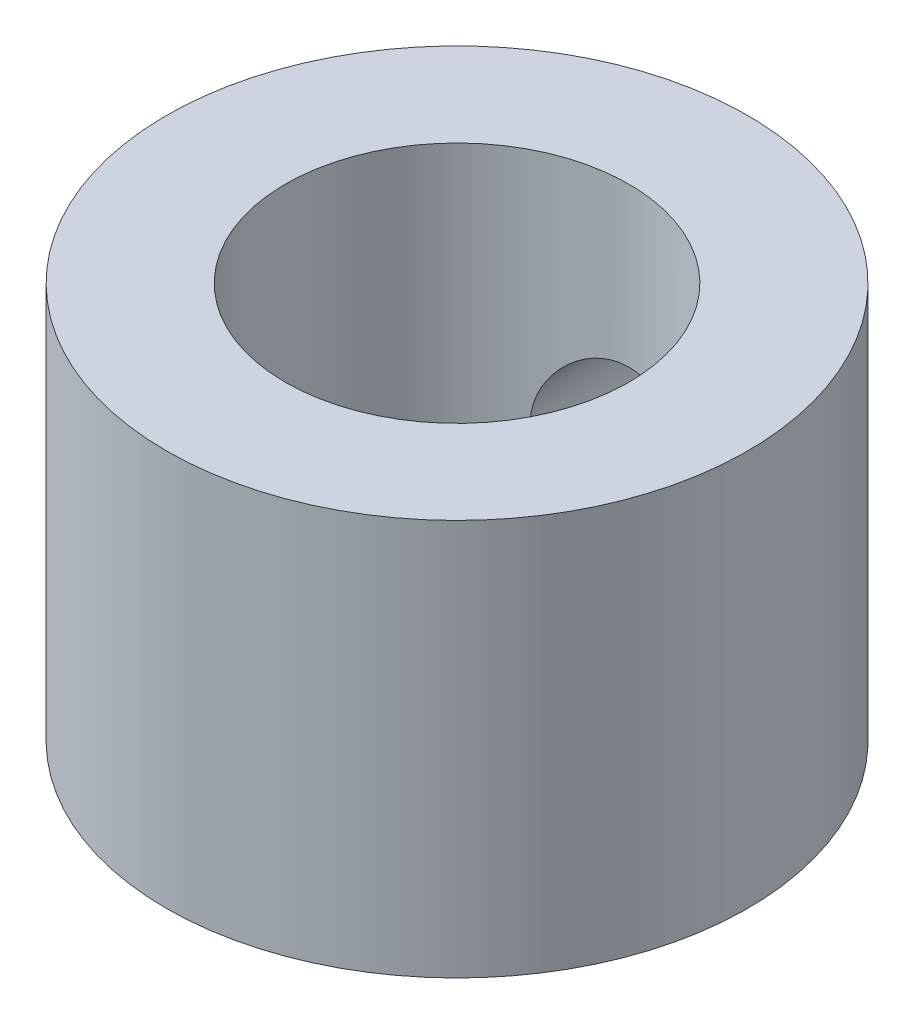
ISO-10303-21;
HEADER;
FILE_DESCRIPTION(('STEP AP214'),'2;1');
FILE_NAME('part.step','',(''),(''),'','','');
FILE_SCHEMA(('AUTOMOTIVE_DESIGN { 1 0 10303 214 1 1 1 1 }'));
ENDSEC;
DATA;
#1=APPLICATION_CONTEXT('core data for automotive mechanical design processes');
#2=APPLICATION_PROTOCOL_DEFINITION('international standard','automotive_design',2000,#1);
#3=PRODUCT_CONTEXT('',#1,'mechanical');
#4=PRODUCT('Part','Part','',(#3));
#5=PRODUCT_RELATED_PRODUCT_CATEGORY('part','',(#4));
#6=PRODUCT_DEFINITION_FORMATION('','',#4);
#7=PRODUCT_DEFINITION_CONTEXT('part definition',#1,'design');
#8=PRODUCT_DEFINITION('design','',#6,#7);
#9=PRODUCT_DEFINITION_SHAPE('','',#8);
#10=(LENGTH_UNIT() NAMED_UNIT(*) SI_UNIT(.MILLI.,.METRE.));
#11=(NAMED_UNIT(*) PLANE_ANGLE_UNIT() SI_UNIT($,.RADIAN.));
#12=(NAMED_UNIT(*) SI_UNIT($,.STERADIAN.) SOLID_ANGLE_UNIT());
#13=UNCERTAINTY_MEASURE_WITH_UNIT(LENGTH_MEASURE(1.E-05),#10,'distance_accuracy_value','');
#14=(GEOMETRIC_REPRESENTATION_CONTEXT(3) GLOBAL_UNCERTAINTY_ASSIGNED_CONTEXT((#13)) GLOBAL_UNIT_ASSIGNED_CONTEXT((#10,
#11,#12)) REPRESENTATION_CONTEXT('',''));
#15=CARTESIAN_POINT('',(0.,0.,0.));
#16=DIRECTION('',(0.,0.,1.));
#17=DIRECTION('',(1.,0.,0.));
#18=AXIS2_PLACEMENT_3D('',#15,#16,#17);
#19=CARTESIAN_POINT('',(0.,15.,0.));
#20=DIRECTION('',(0.,1.,0.));
#21=DIRECTION('',(0.,0.,1.));
#22=AXIS2_PLACEMENT_3D('',#19,#20,#21);
#23=PLANE('',#22);
#24=CARTESIAN_POINT('',(0.,15.,0.));
#25=DIRECTION('',(0.,1.,0.));
#26=DIRECTION('',(0.,0.,1.));
#27=AXIS2_PLACEMENT_3D('',#24,#25,#26);
#28=CIRCLE('',#27,11.);
#29=CARTESIAN_POINT('',(0.,15.,11.));
#30=VERTEX_POINT('',#29);
#31=EDGE_CURVE('E12',#30,#30,#28,.T.);
#32=ORIENTED_EDGE('',*,*,#31,.T.);
#33=EDGE_LOOP('',(#32));
#34=FACE_BOUND('',#33,.T.);
#35=CARTESIAN_POINT('',(0.,15.,0.));
#36=DIRECTION('',(0.,1.,0.));
#37=DIRECTION('',(0.,0.,1.));
#38=AXIS2_PLACEMENT_3D('',#35,#36,#37);
#39=CIRCLE('',#38,6.5);
#40=CARTESIAN_POINT('',(0.,15.,6.5));
#41=VERTEX_POINT('',#40);
#42=EDGE_CURVE('E64',#41,#41,#39,.T.);
#43=ORIENTED_EDGE('',*,*,#42,.F.);
#44=EDGE_LOOP('',(#43));
#45=FACE_BOUND('',#44,.T.);
#46=ADVANCED_FACE('F46',(#34,#45),#23,.T.);
#47=CARTESIAN_POINT('',(0.,0.,0.));
#48=DIRECTION('',(0.,1.,0.));
#49=DIRECTION('',(0.,0.,1.));
#50=AXIS2_PLACEMENT_3D('',#47,#48,#49);
#51=PLANE('',#50);
#52=CARTESIAN_POINT('',(0.,0.,0.));
#53=DIRECTION('',(0.,1.,0.));
#54=DIRECTION('',(0.,0.,1.));
#55=AXIS2_PLACEMENT_3D('',#52,#53,#54);
#56=CIRCLE('',#55,11.);
#57=CARTESIAN_POINT('',(0.,0.,11.));
#58=VERTEX_POINT('',#57);
#59=EDGE_CURVE('E59',#58,#58,#56,.T.);
#60=ORIENTED_EDGE('',*,*,#59,.F.);
#61=EDGE_LOOP('',(#60));
#62=FACE_BOUND('',#61,.T.);
#63=CARTESIAN_POINT('',(0.,0.,0.));
#64=DIRECTION('',(0.,1.,0.));
#65=DIRECTION('',(0.,0.,1.));
#66=AXIS2_PLACEMENT_3D('',#63,#64,#65);
#67=CIRCLE('',#66,6.5);
#68=CARTESIAN_POINT('',(0.,0.,6.5));
#69=VERTEX_POINT('',#68);
#70=EDGE_CURVE('E66',#69,#69,#67,.T.);
#71=ORIENTED_EDGE('',*,*,#70,.T.);
#72=EDGE_LOOP('',(#71));
#73=FACE_BOUND('',#72,.T.);
#74=ADVANCED_FACE('F86',(#62,#73),#51,.F.);
#75=CARTESIAN_POINT('',(0.,15.,0.));
#76=DIRECTION('',(0.,-1.,0.));
#77=DIRECTION('',(0.,0.,-1.));
#78=AXIS2_PLACEMENT_3D('',#75,#76,#77);
#79=CYLINDRICAL_SURFACE('',#78,11.);
#80=CARTESIAN_POINT('',(0.,9.00000000000001,-11.));
#81=CARTESIAN_POINT('',(-0.165241826664359,8.99999637477795,-10.9999976543482));
#82=CARTESIAN_POINT('',(-0.330521957625387,8.98630187283317,-10.9962401452152));
#83=CARTESIAN_POINT('',(-0.656311860315367,8.93198833939365,-10.981615961709));
#84=CARTESIAN_POINT('',(-0.816819455954503,8.89135721674283,-10.97074609481));
#85=CARTESIAN_POINT('',(-1.12831525211077,8.78459653652316,-10.9430954434827));
#86=CARTESIAN_POINT('',(-1.27931573394031,8.71850069467618,-10.9263224773879));
#87=CARTESIAN_POINT('',(-1.56808899231943,8.56281413467515,-10.888633088257));
#88=CARTESIAN_POINT('',(-1.70586072657954,8.47322156729214,-10.8677163391303));
#89=CARTESIAN_POINT('',(-1.96759389514652,8.27080032706547,-10.8234279408412));
#90=CARTESIAN_POINT('',(-2.09119025833987,8.15750911829158,-10.8000128298086));
#91=CARTESIAN_POINT('',(-2.31788587364956,7.91189472794017,-10.7536422587013));
#92=CARTESIAN_POINT('',(-2.42098235649443,7.77956897919535,-10.730686861104));
#93=CARTESIAN_POINT('',(-2.60555589078994,7.49669750484103,-10.6873876832732));
#94=CARTESIAN_POINT('',(-2.68660853675171,7.34586571012742,-10.6670986011725));
#95=CARTESIAN_POINT('',(-2.82205832722454,7.03207234360122,-10.6320701482383));
#96=CARTESIAN_POINT('',(-2.87646063893689,6.869113130223,-10.6173297017151));
#97=CARTESIAN_POINT('',(-2.95578912882535,6.53974420997505,-10.5955169438548));
#98=CARTESIAN_POINT('',(-2.98137921086456,6.37350610367614,-10.5882722456757));
#99=CARTESIAN_POINT('',(-3.00442728818264,6.03895063398236,-10.5817565816817));
#100=CARTESIAN_POINT('',(-3.00189080281764,5.87063368499994,-10.5824840514652));
#101=CARTESIAN_POINT('',(-2.96928383560601,5.54191689806745,-10.5916764975091));
#102=CARTESIAN_POINT('',(-2.94002147337861,5.38142953079554,-10.5999143662734));
#103=CARTESIAN_POINT('',(-2.85608967743611,5.0677334279544,-10.6228351158812));
#104=CARTESIAN_POINT('',(-2.80141813009295,4.91452529906742,-10.6375185328831));
#105=CARTESIAN_POINT('',(-2.66757259652941,4.61765295890511,-10.6718723658465));
#106=CARTESIAN_POINT('',(-2.58811903765894,4.47412159793279,-10.6915991952828));
#107=CARTESIAN_POINT('',(-2.40715976044346,4.20214710518069,-10.7337873759558));
#108=CARTESIAN_POINT('',(-2.30564952212417,4.07370707432251,-10.756249287265));
#109=CARTESIAN_POINT('',(-2.07934693365792,3.83094962038712,-10.8023178998121));
#110=CARTESIAN_POINT('',(-1.95387729233449,3.71726510142213,-10.8259374859423));
#111=CARTESIAN_POINT('',(-1.68536402357725,3.51241807004444,-10.8709729541596));
#112=CARTESIAN_POINT('',(-1.54231963943708,3.42125652790077,-10.8923887412858));
#113=CARTESIAN_POINT('',(-1.24170790747923,3.26374665445016,-10.9307455624252));
#114=CARTESIAN_POINT('',(-1.08407527483553,3.19751732283211,-10.9476650257461));
#115=CARTESIAN_POINT('',(-0.759345377428762,3.09268405497172,-10.9749671228522));
#116=CARTESIAN_POINT('',(-0.592250288635342,3.05407379511175,-10.9853512528913));
#117=CARTESIAN_POINT('',(-0.258736340966483,3.00657876440608,-10.9981845755262));
#118=CARTESIAN_POINT('',(-0.092448595567949,2.99683400935928,-11.0008632625074));
#119=CARTESIAN_POINT('',(0.239386731275946,3.00496549502686,-10.9986460317028));
#120=CARTESIAN_POINT('',(0.404934391065013,3.02283873923299,-10.9937509356601));
#121=CARTESIAN_POINT('',(0.7274901954791,3.08499500540627,-10.977084785319));
#122=CARTESIAN_POINT('',(0.884598648545333,3.12879438551397,-10.965439729442));
#123=CARTESIAN_POINT('',(1.18921973489727,3.24099448928101,-10.9365984707135));
#124=CARTESIAN_POINT('',(1.33673130261003,3.30939793932271,-10.9194016526918));
#125=CARTESIAN_POINT('',(1.62128232238913,3.47043288457121,-10.8808314765631));
#126=CARTESIAN_POINT('',(1.75804920482498,3.56352697452253,-10.8593805909887));
#127=CARTESIAN_POINT('',(2.01432044026184,3.77072257509104,-10.8147797682096));
#128=CARTESIAN_POINT('',(2.13382121235599,3.88482843231711,-10.7916294800541));
#129=CARTESIAN_POINT('',(2.35582120688548,4.13482807606766,-10.7453880311357));
#130=CARTESIAN_POINT('',(2.45771255494157,4.27126676454986,-10.7223188995483));
#131=CARTESIAN_POINT('',(2.63717164416211,4.55979729444656,-10.6796005238857));
#132=CARTESIAN_POINT('',(2.71474035852926,4.71188850924514,-10.6599511429925));
#133=CARTESIAN_POINT('',(2.84277116633765,5.02668125646439,-10.6265249735947));
#134=CARTESIAN_POINT('',(2.89338704610643,5.18931652096059,-10.6127149622546));
#135=CARTESIAN_POINT('',(2.96641834438073,5.52123367595565,-10.5925362923412));
#136=CARTESIAN_POINT('',(2.98884137725659,5.69051375906859,-10.586165624571));
#137=CARTESIAN_POINT('',(3.00439791154423,6.0246768076706,-10.5817601934995));
#138=CARTESIAN_POINT('',(2.99851066433397,6.18951117749587,-10.5834467188085));
#139=CARTESIAN_POINT('',(2.95989675286937,6.51574129550563,-10.5943100332908));
#140=CARTESIAN_POINT('',(2.92717084057026,6.67713713989941,-10.6034866126106));
#141=CARTESIAN_POINT('',(2.83638816870607,6.99061263153777,-10.6281263302191));
#142=CARTESIAN_POINT('',(2.77854790898356,7.14275950647964,-10.6435356626191));
#143=CARTESIAN_POINT('',(2.63934609082675,7.43530655363057,-10.6789037996565));
#144=CARTESIAN_POINT('',(2.55798069008887,7.5757048021314,-10.6988633473566));
#145=CARTESIAN_POINT('',(2.37110861969732,7.84542119538421,-10.741847587665));
#146=CARTESIAN_POINT('',(2.2649380364426,7.97426740968594,-10.7649475169129));
#147=CARTESIAN_POINT('',(2.03272022398542,8.21263281358951,-10.8111998098094));
#148=CARTESIAN_POINT('',(1.90666811877598,8.32214724801075,-10.834352184944));
#149=CARTESIAN_POINT('',(1.63481545137218,8.52118922903873,-10.8787291835493));
#150=CARTESIAN_POINT('',(1.48863173252505,8.61020696173394,-10.8998981550767));
#151=CARTESIAN_POINT('',(1.18279979967856,8.76226487242299,-10.9373052756075));
#152=CARTESIAN_POINT('',(1.02315990484245,8.82532096110868,-10.9535464430238));
#153=CARTESIAN_POINT('',(0.720200202436436,8.915879019958,-10.9772838799153));
#154=CARTESIAN_POINT('',(0.578129280524951,8.94734910248341,-10.9857389536219));
#155=CARTESIAN_POINT('',(0.290715215882988,8.98941005063766,-10.997097743287));
#156=CARTESIAN_POINT('',(0.145372431129918,9.0000031893096,-11.0000020636004));
#157=CARTESIAN_POINT('',(0.,9.00000000000001,-11.));
#158=B_SPLINE_CURVE_WITH_KNOTS('',3,(#80,#81,#82,#83,#84,#85,#86,#87,#88,#89,#90,#91,#92,#93,
#94,#95,#96,#97,#98,#99,#100,#101,#102,#103,#104,#105,#106,#107,#108,#109,#110,#111,#112,#113,
#114,#115,#116,#117,#118,#119,#120,#121,#122,#123,#124,#125,#126,#127,#128,#129,#130,#131,#132,
#133,#134,#135,#136,#137,#138,#139,#140,#141,#142,#143,#144,#145,#146,#147,#148,#149,#150,#151,
#152,#153,#154,#155,#156,#157),.UNSPECIFIED.,.T.,.F.,(4,2,2,2,2,2,2,2,2,2,2,2,2,2,2,2,2,2,2,2,2,
2,2,2,2,2,2,2,2,2,2,2,2,2,2,2,2,2,4),(0.,0.495192213709794,0.990606857102598,1.48536780484117,
1.98016770272944,2.48571756446361,2.99133567318651,3.50609187300443,4.02074822781997,
4.52328609721854,5.02572535393078,5.51345773349774,6.00123069167432,6.49471853535855,
6.98830760278243,7.49877057101551,8.00925552568848,8.52214699472057,9.03492099533889,
9.53225622686165,10.029537502105,10.5178222240039,11.0061610695167,11.5043893801936,
12.0027208731201,12.5158014612974,13.0288615173582,13.5389619291417,14.0489245425547,
14.5413770446734,15.0338157499215,15.5220911132461,16.0104462704815,16.5137802279716,
17.0172378222293,17.532117445911,18.0466810522785,18.4823766419936,18.9180247913559),.UNSPECIFIED.);
#159=CARTESIAN_POINT('',(0.,9.00000000000001,-11.));
#160=VERTEX_POINT('',#159);
#161=EDGE_CURVE('E69',#160,#160,#158,.T.);
#162=ORIENTED_EDGE('',*,*,#161,.T.);
#163=EDGE_LOOP('',(#162));
#164=FACE_BOUND('',#163,.T.);
#165=ORIENTED_EDGE('',*,*,#31,.F.);
#166=EDGE_LOOP('',(#165));
#167=FACE_BOUND('',#166,.T.);
#168=ORIENTED_EDGE('',*,*,#59,.T.);
#169=EDGE_LOOP('',(#168));
#170=FACE_BOUND('',#169,.T.);
#171=ADVANCED_FACE('F48',(#164,#167,#170),#79,.T.);
#172=CARTESIAN_POINT('',(0.,15.,0.));
#173=DIRECTION('',(0.,-1.,0.));
#174=DIRECTION('',(0.,0.,-1.));
#175=AXIS2_PLACEMENT_3D('',#172,#173,#174);
#176=CYLINDRICAL_SURFACE('',#175,6.5);
#177=CARTESIAN_POINT('',(0.,9.00000000000001,-6.49999999999998));
#178=CARTESIAN_POINT('',(-0.159129740023637,8.99999017473007,-6.49999193598449));
#179=CARTESIAN_POINT('',(-0.318496713154485,8.9872633550092,-6.49409129449356));
#180=CARTESIAN_POINT('',(-0.632606247293023,8.93687401404485,-6.47106985631114));
#181=CARTESIAN_POINT('',(-0.787337527979144,8.89915513252582,-6.45392370044471));
#182=CARTESIAN_POINT('',(-1.08714223490982,8.80052257783211,-6.41022516067747));
#183=CARTESIAN_POINT('',(-1.2322488551699,8.7396940798648,-6.38370734269335));
#184=CARTESIAN_POINT('',(-1.51002307569928,8.59696635982487,-6.32376859265665));
#185=CARTESIAN_POINT('',(-1.64269292826373,8.51507096305909,-6.29034891405414));
#186=CARTESIAN_POINT('',(-1.89986895880031,8.3274825838107,-6.21766070429634));
#187=CARTESIAN_POINT('',(-2.02355169196677,8.22074617614938,-6.17817421262096));
#188=CARTESIAN_POINT('',(-2.25199750098768,7.98872874679697,-6.09862012204947));
#189=CARTESIAN_POINT('',(-2.35674840232591,7.86343588553363,-6.05855216699364));
#190=CARTESIAN_POINT('',(-2.55097774210914,7.58827811275504,-5.97948202000591));
#191=CARTESIAN_POINT('',(-2.63906569563088,7.43735860340822,-5.94070870234376));
#192=CARTESIAN_POINT('',(-2.78824385911567,7.1208265061863,-5.87217879105201));
#193=CARTESIAN_POINT('',(-2.84935096753513,6.95522319324721,-5.84241655734447));
#194=CARTESIAN_POINT('',(-2.93924908147223,6.62344905365085,-5.79769142785813));
#195=CARTESIAN_POINT('',(-2.96963584911128,6.45781276080861,-5.78200314681252));
#196=CARTESIAN_POINT('',(-3.002175476791,6.12310854140559,-5.76518133384986));
#197=CARTESIAN_POINT('',(-3.00434957269562,5.95404329186309,-5.7640368547307));
#198=CARTESIAN_POINT('',(-2.98158560174146,5.63505136876399,-5.77583284667211));
#199=CARTESIAN_POINT('',(-2.95928670198314,5.4848744222418,-5.78740239735022));
#200=CARTESIAN_POINT('',(-2.89271218555567,5.19069776762692,-5.82096135525655));
#201=CARTESIAN_POINT('',(-2.84843109629297,5.04669960748253,-5.8429533571526));
#202=CARTESIAN_POINT('',(-2.73827780955064,4.76499143178998,-5.89538912754498));
#203=CARTESIAN_POINT('',(-2.67193346170891,4.62750154525279,-5.92601526462826));
#204=CARTESIAN_POINT('',(-2.51988161713393,4.3649984621007,-5.99225038850182));
#205=CARTESIAN_POINT('',(-2.43416572056868,4.23999071195686,-6.02786153431936));
#206=CARTESIAN_POINT('',(-2.2351817948932,3.99205918617676,-6.10462808948969));
#207=CARTESIAN_POINT('',(-2.11995698607912,3.87075894268323,-6.14597120104821));
#208=CARTESIAN_POINT('',(-1.87050126568228,3.64858899027007,-6.22642723029491));
#209=CARTESIAN_POINT('',(-1.73626371927504,3.54772644343184,-6.26553936273227));
#210=CARTESIAN_POINT('',(-1.44669684750736,3.36613618738702,-6.338776755616));
#211=CARTESIAN_POINT('',(-1.29080393285875,3.28621338448354,-6.37268619348079));
#212=CARTESIAN_POINT('',(-0.965818596709161,3.1543212789014,-6.42995630206117));
#213=CARTESIAN_POINT('',(-0.796735240219256,3.10233296896143,-6.45332414377604));
#214=CARTESIAN_POINT('',(-0.463602839452795,3.0315168463458,-6.48544360814952));
#215=CARTESIAN_POINT('',(-0.300107360641243,3.01051958486213,-6.49514898263157));
#216=CARTESIAN_POINT('',(0.0283509158459387,2.99563787013212,-6.50201026325202));
#217=CARTESIAN_POINT('',(0.193313137929192,3.00174321238446,-6.49917089266059));
#218=CARTESIAN_POINT('',(0.508895457702881,3.03948101723622,-6.48185390166458));
#219=CARTESIAN_POINT('',(0.659759631845781,3.06946203263595,-6.46812943096816));
#220=CARTESIAN_POINT('',(0.954079363496161,3.15165194153626,-6.43130946000993));
#221=CARTESIAN_POINT('',(1.09753404370172,3.20386346044776,-6.40821285291882));
#222=CARTESIAN_POINT('',(1.37801009985269,3.33063531255864,-6.35390691630443));
#223=CARTESIAN_POINT('',(1.51469681576858,3.40583499464222,-6.32246943811058));
#224=CARTESIAN_POINT('',(1.77399872636957,3.57575074864868,-6.25467179735359));
#225=CARTESIAN_POINT('',(1.89660770091262,3.67047539625349,-6.21830947413329));
#226=CARTESIAN_POINT('',(2.13543211180623,3.88623403715671,-6.14060481803728));
#227=CARTESIAN_POINT('',(2.25018643549154,4.00883166984394,-6.09910334732873));
#228=CARTESIAN_POINT('',(2.45803592830907,4.27194231065561,-6.01834862228959));
#229=CARTESIAN_POINT('',(2.5511214048357,4.41246329266641,-5.97909637994754));
#230=CARTESIAN_POINT('',(2.71549078439326,4.71302444504298,-5.90630663365422));
#231=CARTESIAN_POINT('',(2.78603026463062,4.87352638341619,-5.872977843945));
#232=CARTESIAN_POINT('',(2.89837428577099,5.2061754464772,-5.81836702125634));
#233=CARTESIAN_POINT('',(2.94020977297891,5.37830980931597,-5.7970720188129));
#234=CARTESIAN_POINT('',(2.99058122218974,5.71286433748517,-5.77123490611806));
#235=CARTESIAN_POINT('',(3.00174910461878,5.87478588018006,-5.76537064588625));
#236=CARTESIAN_POINT('',(2.99780698335847,6.19819876018097,-5.76742289005738));
#237=CARTESIAN_POINT('',(2.98270389873476,6.35969019954602,-5.775335765934));
#238=CARTESIAN_POINT('',(2.92900530543889,6.66589017025347,-5.80273428313343));
#239=CARTESIAN_POINT('',(2.89212339406146,6.81098330106441,-5.8213734731172));
#240=CARTESIAN_POINT('',(2.79781129073871,7.09286629665378,-5.86728099507622));
#241=CARTESIAN_POINT('',(2.74037502634772,7.22965369365608,-5.89455187686752));
#242=CARTESIAN_POINT('',(2.60228329976768,7.50093182610411,-5.95686250351633));
#243=CARTESIAN_POINT('',(2.52034815272261,7.63467850089652,-5.9922955105788));
#244=CARTESIAN_POINT('',(2.33716116760101,7.88733842358028,-6.06608759795382));
#245=CARTESIAN_POINT('',(2.23590051490249,8.0062448615488,-6.10444800868417));
#246=CARTESIAN_POINT('',(2.00534865465993,8.2378140915404,-6.18424324123371));
#247=CARTESIAN_POINT('',(1.87428881140547,8.348743913788,-6.22561407277446));
#248=CARTESIAN_POINT('',(1.59393984404996,8.54731469902412,-6.30320829595264));
#249=CARTESIAN_POINT('',(1.44464220373002,8.63494472093286,-6.33942926562565));
#250=CARTESIAN_POINT('',(1.2105487387777,8.74627150458625,-6.38677604060826));
#251=CARTESIAN_POINT('',(1.1310652373199,8.77996029023894,-6.40136272006653));
#252=CARTESIAN_POINT('',(0.969110715863051,8.84047216452386,-6.42787190184104));
#253=CARTESIAN_POINT('',(0.886641165315983,8.86729857912802,-6.43979569441627));
#254=CARTESIAN_POINT('',(0.71953407486633,8.91372218892631,-6.4605996915318));
#255=CARTESIAN_POINT('',(0.634902095723729,8.93333625394735,-6.46948699498256));
#256=CARTESIAN_POINT('',(0.464024245926404,8.96516871803235,-6.48398207342717));
#257=CARTESIAN_POINT('',(0.37777949636723,8.97739207105385,-6.48959204511477));
#258=CARTESIAN_POINT('',(0.242771973816698,8.99055542112398,-6.49564511866125));
#259=CARTESIAN_POINT('',(0.194301346625734,8.9940947815264,-6.49727604396627));
#260=CARTESIAN_POINT('',(0.0972278648476602,8.99881859337199,-6.49945472646916));
#261=CARTESIAN_POINT('',(0.048625007888717,9.00000300229127,-6.50000246410767));
#262=CARTESIAN_POINT('',(0.,9.00000000000001,-6.49999999999998));
#263=B_SPLINE_CURVE_WITH_KNOTS('',3,(#177,#178,#179,#180,#181,#182,#183,#184,#185,#186,#187,
#188,#189,#190,#191,#192,#193,#194,#195,#196,#197,#198,#199,#200,#201,#202,#203,#204,#205,#206,
#207,#208,#209,#210,#211,#212,#213,#214,#215,#216,#217,#218,#219,#220,#221,#222,#223,#224,#225,
#226,#227,#228,#229,#230,#231,#232,#233,#234,#235,#236,#237,#238,#239,#240,#241,#242,#243,#244,
#245,#246,#247,#248,#249,#250,#251,#252,#253,#254,#255,#256,#257,#258,#259,#260,#261,#262),
.UNSPECIFIED.,.T.,.F.,(4,2,2,2,2,2,2,2,2,2,2,2,2,2,2,2,2,2,2,2,2,2,2,2,2,2,2,2,2,2,2,2,2,2,2,2,
2,2,2,2,2,2,4),(0.,0.477200204967811,0.955480236490587,1.43201430730959,1.90846191054196,
2.41054736697621,2.91295456010354,3.44723474488288,3.98117982667256,4.48569061951829,
4.98982164171925,5.44449010747478,5.89927182239015,6.36448978686468,6.82990986610931,
7.34463261353581,7.85953542698886,8.3920159488015,8.92413369853155,9.41686930204893,
9.90941939960484,10.3705828952427,10.8318008691632,11.3072372627792,11.7828829224499,
12.2995111125967,12.8163699514819,13.3488589877167,13.8807730317792,14.3653541002028,
14.8498075623387,15.3004415694755,15.7512088190771,16.2316520984592,16.7123150404513,
17.2397422544707,17.767416701186,18.0297750672698,18.2920060346837,18.553619677245,
18.815057766518,18.960872400173,19.106689666811),.UNSPECIFIED.);
#264=CARTESIAN_POINT('',(0.,9.00000000000001,-6.49999999999998));
#265=VERTEX_POINT('',#264);
#266=EDGE_CURVE('E51',#265,#265,#263,.T.);
#267=ORIENTED_EDGE('',*,*,#266,.F.);
#268=EDGE_LOOP('',(#267));
#269=FACE_BOUND('',#268,.T.);
#270=ORIENTED_EDGE('',*,*,#42,.T.);
#271=EDGE_LOOP('',(#270));
#272=FACE_BOUND('',#271,.T.);
#273=ORIENTED_EDGE('',*,*,#70,.F.);
#274=EDGE_LOOP('',(#273));
#275=FACE_BOUND('',#274,.T.);
#276=ADVANCED_FACE('F78',(#269,#272,#275),#176,.F.);
#277=CARTESIAN_POINT('',(0.,6.00000000000001,-11.));
#278=DIRECTION('',(0.,0.,1.));
#279=DIRECTION('',(1.,0.,0.));
#280=AXIS2_PLACEMENT_3D('',#277,#278,#279);
#281=CYLINDRICAL_SURFACE('',#280,3.);
#282=ORIENTED_EDGE('',*,*,#266,.T.);
#283=EDGE_LOOP('',(#282));
#284=FACE_BOUND('',#283,.T.);
#285=ORIENTED_EDGE('',*,*,#161,.F.);
#286=EDGE_LOOP('',(#285));
#287=FACE_BOUND('',#286,.T.);
#288=ADVANCED_FACE('F75',(#284,#287),#281,.F.);
#289=CLOSED_SHELL('',(#46,#74,#171,#276,#288));
#290=MANIFOLD_SOLID_BREP('B2',#289);
#291=ADVANCED_BREP_SHAPE_REPRESENTATION('',(#18,#290),#14);
#292=SHAPE_DEFINITION_REPRESENTATION(#9,#291);
ENDSEC;
END-ISO-10303-21;
